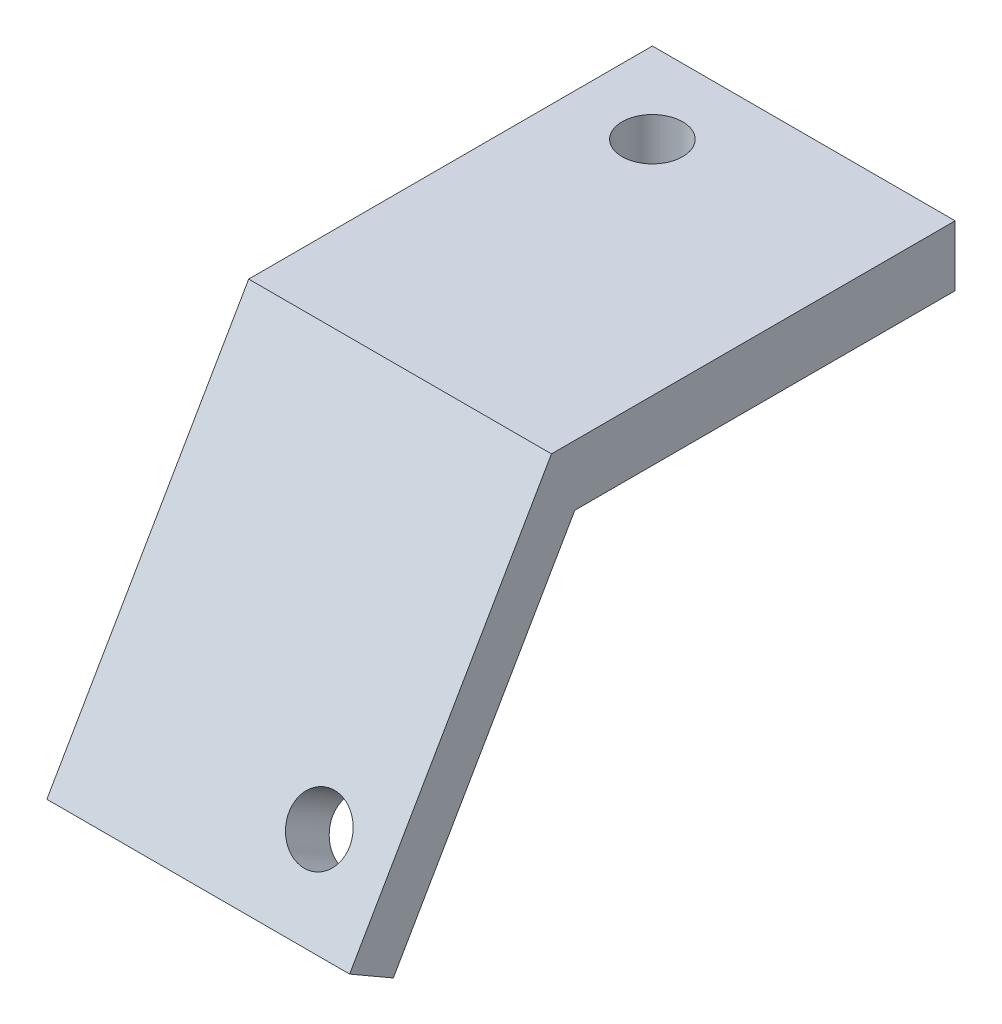
ISO-10303-21;
HEADER;
FILE_DESCRIPTION(('STEP AP214'),'2;1');
FILE_NAME('part.step','',(''),(''),'','','');
FILE_SCHEMA(('AUTOMOTIVE_DESIGN { 1 0 10303 214 1 1 1 1 }'));
ENDSEC;
DATA;
#1=APPLICATION_CONTEXT('core data for automotive mechanical design processes');
#2=APPLICATION_PROTOCOL_DEFINITION('international standard','automotive_design',2000,#1);
#3=PRODUCT_CONTEXT('',#1,'mechanical');
#4=PRODUCT('Part','Part','',(#3));
#5=PRODUCT_RELATED_PRODUCT_CATEGORY('part','',(#4));
#6=PRODUCT_DEFINITION_FORMATION('','',#4);
#7=PRODUCT_DEFINITION_CONTEXT('part definition',#1,'design');
#8=PRODUCT_DEFINITION('design','',#6,#7);
#9=PRODUCT_DEFINITION_SHAPE('','',#8);
#10=(LENGTH_UNIT() NAMED_UNIT(*) SI_UNIT(.MILLI.,.METRE.));
#11=(NAMED_UNIT(*) PLANE_ANGLE_UNIT() SI_UNIT($,.RADIAN.));
#12=(NAMED_UNIT(*) SI_UNIT($,.STERADIAN.) SOLID_ANGLE_UNIT());
#13=UNCERTAINTY_MEASURE_WITH_UNIT(LENGTH_MEASURE(1.E-05),#10,'distance_accuracy_value','');
#14=(GEOMETRIC_REPRESENTATION_CONTEXT(3) GLOBAL_UNCERTAINTY_ASSIGNED_CONTEXT((#13)) GLOBAL_UNIT_ASSIGNED_CONTEXT((#10,
#11,#12)) REPRESENTATION_CONTEXT('',''));
#15=CARTESIAN_POINT('',(0.,0.,0.));
#16=DIRECTION('',(0.,0.,1.));
#17=DIRECTION('',(1.,0.,0.));
#18=AXIS2_PLACEMENT_3D('',#15,#16,#17);
#19=CARTESIAN_POINT('',(0.,3.,0.));
#20=DIRECTION('',(0.,-1.,0.));
#21=DIRECTION('',(0.,0.,-1.));
#22=AXIS2_PLACEMENT_3D('',#19,#20,#21);
#23=PLANE('',#22);
#24=DIRECTION('',(0.,0.,-1.));
#25=VECTOR('',#24,1.);
#26=CARTESIAN_POINT('',(7.5,3.,10.));
#27=LINE('',#26,#25);
#28=CARTESIAN_POINT('',(7.5,3.,10.));
#29=VERTEX_POINT('',#28);
#30=CARTESIAN_POINT('',(7.5,3.,-10.));
#31=VERTEX_POINT('',#30);
#32=EDGE_CURVE('E101',#29,#31,#27,.T.);
#33=ORIENTED_EDGE('',*,*,#32,.T.);
#34=DIRECTION('',(-1.,0.,0.));
#35=VECTOR('',#34,1.);
#36=CARTESIAN_POINT('',(-7.5,3.,-10.));
#37=LINE('',#36,#35);
#38=CARTESIAN_POINT('',(-7.5,3.,-10.));
#39=VERTEX_POINT('',#38);
#40=EDGE_CURVE('E92',#31,#39,#37,.T.);
#41=ORIENTED_EDGE('',*,*,#40,.T.);
#42=DIRECTION('',(0.,0.,1.));
#43=VECTOR('',#42,1.);
#44=CARTESIAN_POINT('',(-7.5,3.,10.));
#45=LINE('',#44,#43);
#46=CARTESIAN_POINT('',(-7.5,3.,10.));
#47=VERTEX_POINT('',#46);
#48=EDGE_CURVE('E100',#39,#47,#45,.T.);
#49=ORIENTED_EDGE('',*,*,#48,.T.);
#50=DIRECTION('',(1.,0.,0.));
#51=VECTOR('',#50,1.);
#52=CARTESIAN_POINT('',(-7.5,3.,10.));
#53=LINE('',#52,#51);
#54=EDGE_CURVE('E105',#47,#29,#53,.T.);
#55=ORIENTED_EDGE('',*,*,#54,.T.);
#56=EDGE_LOOP('',(#33,#41,#49,#55));
#57=FACE_BOUND('',#56,.T.);
#58=CARTESIAN_POINT('',(-3.5,3.,-6.));
#59=DIRECTION('',(0.,1.,0.));
#60=DIRECTION('',(0.,0.,1.));
#61=AXIS2_PLACEMENT_3D('',#58,#59,#60);
#62=CIRCLE('',#61,1.5);
#63=CARTESIAN_POINT('',(-3.5,3.,-4.5));
#64=VERTEX_POINT('',#63);
#65=EDGE_CURVE('E152',#64,#64,#62,.T.);
#66=ORIENTED_EDGE('',*,*,#65,.F.);
#67=EDGE_LOOP('',(#66));
#68=FACE_BOUND('',#67,.T.);
#69=ADVANCED_FACE('F43',(#57,#68),#23,.F.);
#70=CARTESIAN_POINT('',(0.,0.,0.));
#71=DIRECTION('',(0.,-1.,0.));
#72=DIRECTION('',(0.,0.,-1.));
#73=AXIS2_PLACEMENT_3D('',#70,#71,#72);
#74=PLANE('',#73);
#75=DIRECTION('',(1.,0.,0.));
#76=VECTOR('',#75,1.);
#77=CARTESIAN_POINT('',(0.,0.,8.84529946162075));
#78=LINE('',#77,#76);
#79=CARTESIAN_POINT('',(-7.5,0.,8.84529946162075));
#80=VERTEX_POINT('',#79);
#81=CARTESIAN_POINT('',(7.5,0.,8.84529946162074));
#82=VERTEX_POINT('',#81);
#83=EDGE_CURVE('E160',#80,#82,#78,.T.);
#84=ORIENTED_EDGE('',*,*,#83,.F.);
#85=DIRECTION('',(0.,0.,1.));
#86=VECTOR('',#85,1.);
#87=CARTESIAN_POINT('',(-7.5,0.,10.));
#88=LINE('',#87,#86);
#89=CARTESIAN_POINT('',(-7.5,0.,-10.));
#90=VERTEX_POINT('',#89);
#91=EDGE_CURVE('E107',#90,#80,#88,.T.);
#92=ORIENTED_EDGE('',*,*,#91,.F.);
#93=DIRECTION('',(-1.,0.,0.));
#94=VECTOR('',#93,1.);
#95=CARTESIAN_POINT('',(-7.5,0.,-10.));
#96=LINE('',#95,#94);
#97=CARTESIAN_POINT('',(7.5,0.,-10.));
#98=VERTEX_POINT('',#97);
#99=EDGE_CURVE('E141',#98,#90,#96,.T.);
#100=ORIENTED_EDGE('',*,*,#99,.F.);
#101=DIRECTION('',(0.,0.,-1.));
#102=VECTOR('',#101,1.);
#103=CARTESIAN_POINT('',(7.5,0.,10.));
#104=LINE('',#103,#102);
#105=EDGE_CURVE('E74',#82,#98,#104,.T.);
#106=ORIENTED_EDGE('',*,*,#105,.F.);
#107=EDGE_LOOP('',(#84,#92,#100,#106));
#108=FACE_BOUND('',#107,.T.);
#109=CARTESIAN_POINT('',(-3.5,0.,-6.));
#110=DIRECTION('',(0.,1.,0.));
#111=DIRECTION('',(0.,0.,1.));
#112=AXIS2_PLACEMENT_3D('',#109,#110,#111);
#113=CIRCLE('',#112,1.5);
#114=CARTESIAN_POINT('',(-3.5,0.,-4.5));
#115=VERTEX_POINT('',#114);
#116=EDGE_CURVE('E155',#115,#115,#113,.T.);
#117=ORIENTED_EDGE('',*,*,#116,.T.);
#118=EDGE_LOOP('',(#117));
#119=FACE_BOUND('',#118,.T.);
#120=ADVANCED_FACE('F113',(#108,#119),#74,.T.);
#121=CARTESIAN_POINT('',(7.5,3.,10.));
#122=DIRECTION('',(-1.,0.,0.));
#123=DIRECTION('',(0.,0.,1.));
#124=AXIS2_PLACEMENT_3D('',#121,#122,#123);
#125=PLANE('',#124);
#126=DIRECTION('',(0.,0.866025403784436,-0.500000000000004));
#127=VECTOR('',#126,1.);
#128=CARTESIAN_POINT('',(7.5,-15.5705080756887,17.834936490539));
#129=LINE('',#128,#127);
#130=CARTESIAN_POINT('',(7.5,-15.5705080756887,17.834936490539));
#131=VERTEX_POINT('',#130);
#132=EDGE_CURVE('E111',#131,#82,#129,.T.);
#133=ORIENTED_EDGE('',*,*,#132,.T.);
#134=ORIENTED_EDGE('',*,*,#105,.T.);
#135=DIRECTION('',(0.,-1.,0.));
#136=VECTOR('',#135,1.);
#137=CARTESIAN_POINT('',(7.5,3.,-10.));
#138=LINE('',#137,#136);
#139=EDGE_CURVE('E11',#31,#98,#138,.T.);
#140=ORIENTED_EDGE('',*,*,#139,.F.);
#141=ORIENTED_EDGE('',*,*,#32,.F.);
#142=DIRECTION('',(0.,0.866025403784436,-0.500000000000004));
#143=VECTOR('',#142,1.);
#144=CARTESIAN_POINT('',(7.5,-14.3205080756887,20.0000000000001));
#145=LINE('',#144,#143);
#146=CARTESIAN_POINT('',(7.5,-14.3205080756887,20.0000000000001));
#147=VERTEX_POINT('',#146);
#148=EDGE_CURVE('E61',#147,#29,#145,.T.);
#149=ORIENTED_EDGE('',*,*,#148,.F.);
#150=DIRECTION('',(0.,-0.500000000000004,-0.866025403784436));
#151=VECTOR('',#150,1.);
#152=CARTESIAN_POINT('',(7.5,-15.5705080756887,17.834936490539));
#153=LINE('',#152,#151);
#154=EDGE_CURVE('E178',#147,#131,#153,.T.);
#155=ORIENTED_EDGE('',*,*,#154,.T.);
#156=EDGE_LOOP('',(#133,#134,#140,#141,#149,#155));
#157=FACE_BOUND('',#156,.T.);
#158=ADVANCED_FACE('F45',(#157),#125,.F.);
#159=CARTESIAN_POINT('',(-7.5,3.,-10.));
#160=DIRECTION('',(0.,0.,1.));
#161=DIRECTION('',(1.,0.,0.));
#162=AXIS2_PLACEMENT_3D('',#159,#160,#161);
#163=PLANE('',#162);
#164=ORIENTED_EDGE('',*,*,#99,.T.);
#165=DIRECTION('',(0.,-1.,0.));
#166=VECTOR('',#165,1.);
#167=CARTESIAN_POINT('',(-7.5,3.,-10.));
#168=LINE('',#167,#166);
#169=EDGE_CURVE('E53',#39,#90,#168,.T.);
#170=ORIENTED_EDGE('',*,*,#169,.F.);
#171=ORIENTED_EDGE('',*,*,#40,.F.);
#172=ORIENTED_EDGE('',*,*,#139,.T.);
#173=EDGE_LOOP('',(#164,#170,#171,#172));
#174=FACE_BOUND('',#173,.T.);
#175=ADVANCED_FACE('F94',(#174),#163,.F.);
#176=CARTESIAN_POINT('',(-7.5,3.,10.));
#177=DIRECTION('',(1.,0.,0.));
#178=DIRECTION('',(0.,0.,-1.));
#179=AXIS2_PLACEMENT_3D('',#176,#177,#178);
#180=PLANE('',#179);
#181=ORIENTED_EDGE('',*,*,#91,.T.);
#182=DIRECTION('',(0.,0.866025403784436,-0.500000000000004));
#183=VECTOR('',#182,1.);
#184=CARTESIAN_POINT('',(-7.5,-15.5705080756887,17.834936490539));
#185=LINE('',#184,#183);
#186=CARTESIAN_POINT('',(-7.5,-15.5705080756887,17.834936490539));
#187=VERTEX_POINT('',#186);
#188=EDGE_CURVE('E84',#187,#80,#185,.T.);
#189=ORIENTED_EDGE('',*,*,#188,.F.);
#190=DIRECTION('',(0.,0.500000000000004,0.866025403784436));
#191=VECTOR('',#190,1.);
#192=CARTESIAN_POINT('',(-7.5,-15.5705080756887,17.834936490539));
#193=LINE('',#192,#191);
#194=CARTESIAN_POINT('',(-7.5,-14.3205080756887,20.0000000000001));
#195=VERTEX_POINT('',#194);
#196=EDGE_CURVE('E184',#187,#195,#193,.T.);
#197=ORIENTED_EDGE('',*,*,#196,.T.);
#198=DIRECTION('',(0.,0.866025403784436,-0.500000000000004));
#199=VECTOR('',#198,1.);
#200=CARTESIAN_POINT('',(-7.5,-14.3205080756887,20.0000000000001));
#201=LINE('',#200,#199);
#202=EDGE_CURVE('E165',#195,#47,#201,.T.);
#203=ORIENTED_EDGE('',*,*,#202,.T.);
#204=ORIENTED_EDGE('',*,*,#48,.F.);
#205=ORIENTED_EDGE('',*,*,#169,.T.);
#206=EDGE_LOOP('',(#181,#189,#197,#203,#204,#205));
#207=FACE_BOUND('',#206,.T.);
#208=ADVANCED_FACE('F118',(#207),#180,.F.);
#209=CARTESIAN_POINT('',(-3.5,3.,-6.));
#210=DIRECTION('',(0.,-1.,0.));
#211=DIRECTION('',(0.,0.,-1.));
#212=AXIS2_PLACEMENT_3D('',#209,#210,#211);
#213=CYLINDRICAL_SURFACE('',#212,1.5);
#214=ORIENTED_EDGE('',*,*,#65,.T.);
#215=EDGE_LOOP('',(#214));
#216=FACE_BOUND('',#215,.T.);
#217=ORIENTED_EDGE('',*,*,#116,.F.);
#218=EDGE_LOOP('',(#217));
#219=FACE_BOUND('',#218,.T.);
#220=ADVANCED_FACE('F126',(#216,#219),#213,.F.);
#221=CARTESIAN_POINT('',(-7.5,-15.5705080756887,17.834936490539));
#222=DIRECTION('',(0.,-0.500000000000004,-0.866025403784436));
#223=DIRECTION('',(0.,0.866025403784436,-0.500000000000004));
#224=AXIS2_PLACEMENT_3D('',#221,#222,#223);
#225=PLANE('',#224);
#226=CARTESIAN_POINT('',(4.,-12.106406460551,15.834936490539));
#227=DIRECTION('',(0.,-0.500000000000004,-0.866025403784436));
#228=DIRECTION('',(0.,0.866025403784436,-0.500000000000004));
#229=AXIS2_PLACEMENT_3D('',#226,#227,#228);
#230=CIRCLE('',#229,1.5);
#231=CARTESIAN_POINT('',(4.,-10.8073683548743,15.084936490539));
#232=VERTEX_POINT('',#231);
#233=EDGE_CURVE('E187',#232,#232,#230,.T.);
#234=ORIENTED_EDGE('',*,*,#233,.F.);
#235=EDGE_LOOP('',(#234));
#236=FACE_BOUND('',#235,.T.);
#237=ORIENTED_EDGE('',*,*,#188,.T.);
#238=ORIENTED_EDGE('',*,*,#83,.T.);
#239=ORIENTED_EDGE('',*,*,#132,.F.);
#240=DIRECTION('',(-1.,0.,0.));
#241=VECTOR('',#240,1.);
#242=CARTESIAN_POINT('',(-7.5,-15.5705080756887,17.834936490539));
#243=LINE('',#242,#241);
#244=EDGE_CURVE('E169',#131,#187,#243,.T.);
#245=ORIENTED_EDGE('',*,*,#244,.T.);
#246=EDGE_LOOP('',(#237,#238,#239,#245));
#247=FACE_BOUND('',#246,.T.);
#248=ADVANCED_FACE('F134',(#236,#247),#225,.T.);
#249=CARTESIAN_POINT('',(-7.5,-14.3205080756887,20.0000000000001));
#250=DIRECTION('',(0.,0.500000000000004,0.866025403784436));
#251=DIRECTION('',(0.,-0.866025403784436,0.500000000000004));
#252=AXIS2_PLACEMENT_3D('',#249,#250,#251);
#253=PLANE('',#252);
#254=CARTESIAN_POINT('',(4.,-10.856406460551,18.0000000000001));
#255=DIRECTION('',(0.,0.500000000000004,0.866025403784436));
#256=DIRECTION('',(0.,-0.866025403784436,0.500000000000004));
#257=AXIS2_PLACEMENT_3D('',#254,#255,#256);
#258=CIRCLE('',#257,1.5);
#259=CARTESIAN_POINT('',(4.,-12.1554445662276,18.7500000000001));
#260=VERTEX_POINT('',#259);
#261=EDGE_CURVE('E191',#260,#260,#258,.T.);
#262=ORIENTED_EDGE('',*,*,#261,.F.);
#263=EDGE_LOOP('',(#262));
#264=FACE_BOUND('',#263,.T.);
#265=ORIENTED_EDGE('',*,*,#54,.F.);
#266=ORIENTED_EDGE('',*,*,#202,.F.);
#267=DIRECTION('',(1.,0.,0.));
#268=VECTOR('',#267,1.);
#269=CARTESIAN_POINT('',(-7.5,-14.3205080756887,20.0000000000001));
#270=LINE('',#269,#268);
#271=EDGE_CURVE('E181',#195,#147,#270,.T.);
#272=ORIENTED_EDGE('',*,*,#271,.T.);
#273=ORIENTED_EDGE('',*,*,#148,.T.);
#274=EDGE_LOOP('',(#265,#266,#272,#273));
#275=FACE_BOUND('',#274,.T.);
#276=ADVANCED_FACE('F198',(#264,#275),#253,.T.);
#277=CARTESIAN_POINT('',(0.,-19.400635094611,11.2009618943235));
#278=DIRECTION('',(0.,0.866025403784436,-0.500000000000004));
#279=DIRECTION('',(0.,0.500000000000004,0.866025403784436));
#280=AXIS2_PLACEMENT_3D('',#277,#278,#279);
#281=PLANE('',#280);
#282=ORIENTED_EDGE('',*,*,#196,.F.);
#283=ORIENTED_EDGE('',*,*,#244,.F.);
#284=ORIENTED_EDGE('',*,*,#154,.F.);
#285=ORIENTED_EDGE('',*,*,#271,.F.);
#286=EDGE_LOOP('',(#282,#283,#284,#285));
#287=FACE_BOUND('',#286,.T.);
#288=ADVANCED_FACE('F200',(#287),#281,.F.);
#289=CARTESIAN_POINT('',(4.,-15.856406460551,9.3397459621557));
#290=DIRECTION('',(0.,0.500000000000004,0.866025403784436));
#291=DIRECTION('',(0.,-0.866025403784436,0.500000000000004));
#292=AXIS2_PLACEMENT_3D('',#289,#290,#291);
#293=CYLINDRICAL_SURFACE('',#292,1.5);
#294=ORIENTED_EDGE('',*,*,#233,.T.);
#295=EDGE_LOOP('',(#294));
#296=FACE_BOUND('',#295,.T.);
#297=ORIENTED_EDGE('',*,*,#261,.T.);
#298=EDGE_LOOP('',(#297));
#299=FACE_BOUND('',#298,.T.);
#300=ADVANCED_FACE('F196',(#296,#299),#293,.F.);
#301=CLOSED_SHELL('',(#69,#120,#158,#175,#208,#220,#248,#276,#288,#300));
#302=MANIFOLD_SOLID_BREP('B2',#301);
#303=ADVANCED_BREP_SHAPE_REPRESENTATION('',(#18,#302),#14);
#304=SHAPE_DEFINITION_REPRESENTATION(#9,#303);
ENDSEC;
END-ISO-10303-21;
